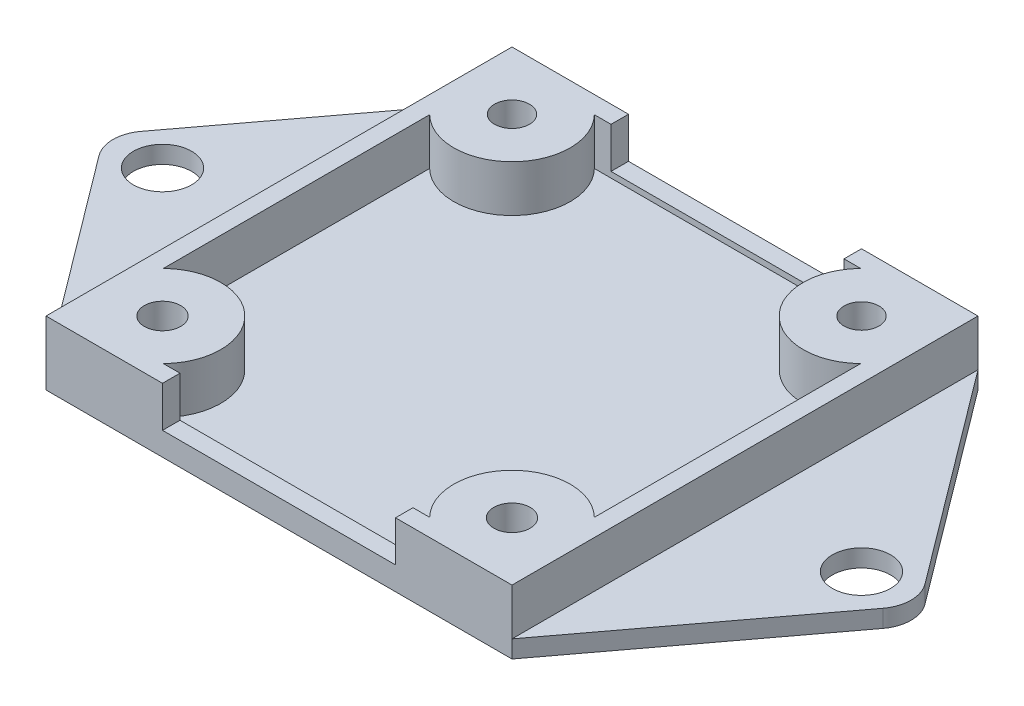
ISO-10303-21;
HEADER;
FILE_DESCRIPTION(('STEP AP214'),'2;1');
FILE_NAME('part.step','',(''),(''),'','','');
FILE_SCHEMA(('AUTOMOTIVE_DESIGN { 1 0 10303 214 1 1 1 1 }'));
ENDSEC;
DATA;
#1=APPLICATION_CONTEXT('core data for automotive mechanical design processes');
#2=APPLICATION_PROTOCOL_DEFINITION('international standard','automotive_design',2000,#1);
#3=PRODUCT_CONTEXT('',#1,'mechanical');
#4=PRODUCT('Part','Part','',(#3));
#5=PRODUCT_RELATED_PRODUCT_CATEGORY('part','',(#4));
#6=PRODUCT_DEFINITION_FORMATION('','',#4);
#7=PRODUCT_DEFINITION_CONTEXT('part definition',#1,'design');
#8=PRODUCT_DEFINITION('design','',#6,#7);
#9=PRODUCT_DEFINITION_SHAPE('','',#8);
#10=(LENGTH_UNIT() NAMED_UNIT(*) SI_UNIT(.MILLI.,.METRE.));
#11=(NAMED_UNIT(*) PLANE_ANGLE_UNIT() SI_UNIT($,.RADIAN.));
#12=(NAMED_UNIT(*) SI_UNIT($,.STERADIAN.) SOLID_ANGLE_UNIT());
#13=UNCERTAINTY_MEASURE_WITH_UNIT(LENGTH_MEASURE(1.E-05),#10,'distance_accuracy_value','');
#14=(GEOMETRIC_REPRESENTATION_CONTEXT(3) GLOBAL_UNCERTAINTY_ASSIGNED_CONTEXT((#13)) GLOBAL_UNIT_ASSIGNED_CONTEXT((#10,
#11,#12)) REPRESENTATION_CONTEXT('',''));
#15=CARTESIAN_POINT('',(0.,0.,0.));
#16=DIRECTION('',(0.,0.,1.));
#17=DIRECTION('',(1.,0.,0.));
#18=AXIS2_PLACEMENT_3D('',#15,#16,#17);
#19=CARTESIAN_POINT('',(0.,5.5,0.));
#20=DIRECTION('',(0.,1.,0.));
#21=DIRECTION('',(0.,0.,1.));
#22=AXIS2_PLACEMENT_3D('',#19,#20,#21);
#23=PLANE('',#22);
#24=DIRECTION('',(0.,0.,-1.));
#25=VECTOR('',#24,1.);
#26=CARTESIAN_POINT('',(9.99999999999999,5.5,-18.));
#27=LINE('',#26,#25);
#28=CARTESIAN_POINT('',(9.99999999999999,5.5,-18.5));
#29=VERTEX_POINT('',#28);
#30=CARTESIAN_POINT('',(9.99999999999999,5.5,-20.));
#31=VERTEX_POINT('',#30);
#32=EDGE_CURVE('E222',#29,#31,#27,.T.);
#33=ORIENTED_EDGE('',*,*,#32,.F.);
#34=DIRECTION('',(-1.,0.,0.));
#35=VECTOR('',#34,1.);
#36=CARTESIAN_POINT('',(-11.4292857857286,5.5,-18.5));
#37=LINE('',#36,#35);
#38=CARTESIAN_POINT('',(11.4292857857286,5.5,-18.5));
#39=VERTEX_POINT('',#38);
#40=EDGE_CURVE('E276',#39,#29,#37,.T.);
#41=ORIENTED_EDGE('',*,*,#40,.F.);
#42=CARTESIAN_POINT('',(15.,5.5,-15.));
#43=DIRECTION('',(0.,-1.,0.));
#44=DIRECTION('',(0.,0.,-1.));
#45=AXIS2_PLACEMENT_3D('',#42,#43,#44);
#46=CIRCLE('',#45,5.00000000000001);
#47=CARTESIAN_POINT('',(18.5,5.5,-11.4292857857286));
#48=VERTEX_POINT('',#47);
#49=EDGE_CURVE('E272',#48,#39,#46,.T.);
#50=ORIENTED_EDGE('',*,*,#49,.F.);
#51=DIRECTION('',(0.,0.,-1.));
#52=VECTOR('',#51,1.);
#53=CARTESIAN_POINT('',(18.5,5.5,-11.4292857857286));
#54=LINE('',#53,#52);
#55=CARTESIAN_POINT('',(18.5,5.5,11.4292857857286));
#56=VERTEX_POINT('',#55);
#57=EDGE_CURVE('E292',#56,#48,#54,.T.);
#58=ORIENTED_EDGE('',*,*,#57,.F.);
#59=CARTESIAN_POINT('',(15.,5.5,15.));
#60=DIRECTION('',(0.,-1.,0.));
#61=DIRECTION('',(0.,0.,1.));
#62=AXIS2_PLACEMENT_3D('',#59,#60,#61);
#63=CIRCLE('',#62,5.00000000000001);
#64=CARTESIAN_POINT('',(11.4292857857286,5.5,18.5));
#65=VERTEX_POINT('',#64);
#66=EDGE_CURVE('E289',#65,#56,#63,.T.);
#67=ORIENTED_EDGE('',*,*,#66,.F.);
#68=DIRECTION('',(1.,0.,0.));
#69=VECTOR('',#68,1.);
#70=CARTESIAN_POINT('',(-11.4292857857286,5.5,18.5));
#71=LINE('',#70,#69);
#72=CARTESIAN_POINT('',(10.,5.5,18.5));
#73=VERTEX_POINT('',#72);
#74=EDGE_CURVE('E285',#73,#65,#71,.T.);
#75=ORIENTED_EDGE('',*,*,#74,.F.);
#76=DIRECTION('',(0.,0.,1.));
#77=VECTOR('',#76,1.);
#78=CARTESIAN_POINT('',(10.,5.5,18.));
#79=LINE('',#78,#77);
#80=CARTESIAN_POINT('',(10.,5.5,20.));
#81=VERTEX_POINT('',#80);
#82=EDGE_CURVE('E244',#73,#81,#79,.T.);
#83=ORIENTED_EDGE('',*,*,#82,.T.);
#84=DIRECTION('',(1.,0.,0.));
#85=VECTOR('',#84,1.);
#86=CARTESIAN_POINT('',(-20.,5.5,20.));
#87=LINE('',#86,#85);
#88=CARTESIAN_POINT('',(20.,5.5,20.));
#89=VERTEX_POINT('',#88);
#90=EDGE_CURVE('E343',#81,#89,#87,.T.);
#91=ORIENTED_EDGE('',*,*,#90,.T.);
#92=DIRECTION('',(0.,0.,-1.));
#93=VECTOR('',#92,1.);
#94=CARTESIAN_POINT('',(20.,5.5,-20.));
#95=LINE('',#94,#93);
#96=CARTESIAN_POINT('',(20.,5.5,-20.));
#97=VERTEX_POINT('',#96);
#98=EDGE_CURVE('E334',#89,#97,#95,.T.);
#99=ORIENTED_EDGE('',*,*,#98,.T.);
#100=DIRECTION('',(-1.,0.,0.));
#101=VECTOR('',#100,1.);
#102=CARTESIAN_POINT('',(-20.,5.5,-20.));
#103=LINE('',#102,#101);
#104=EDGE_CURVE('E339',#97,#31,#103,.T.);
#105=ORIENTED_EDGE('',*,*,#104,.T.);
#106=EDGE_LOOP('',(#33,#41,#50,#58,#67,#75,#83,#91,#99,#105));
#107=FACE_BOUND('',#106,.T.);
#108=CARTESIAN_POINT('',(15.,5.5,-15.));
#109=DIRECTION('',(0.,1.,0.));
#110=DIRECTION('',(0.,0.,-1.));
#111=AXIS2_PLACEMENT_3D('',#108,#109,#110);
#112=CIRCLE('',#111,1.5);
#113=CARTESIAN_POINT('',(15.,5.5,-16.5));
#114=VERTEX_POINT('',#113);
#115=EDGE_CURVE('E247',#114,#114,#112,.T.);
#116=ORIENTED_EDGE('',*,*,#115,.F.);
#117=EDGE_LOOP('',(#116));
#118=FACE_BOUND('',#117,.T.);
#119=CARTESIAN_POINT('',(15.,5.5,15.));
#120=DIRECTION('',(0.,1.,0.));
#121=DIRECTION('',(0.,0.,1.));
#122=AXIS2_PLACEMENT_3D('',#119,#120,#121);
#123=CIRCLE('',#122,1.55820488692154);
#124=CARTESIAN_POINT('',(15.,5.5,16.5582048869215));
#125=VERTEX_POINT('',#124);
#126=EDGE_CURVE('E263',#125,#125,#123,.T.);
#127=ORIENTED_EDGE('',*,*,#126,.F.);
#128=EDGE_LOOP('',(#127));
#129=FACE_BOUND('',#128,.T.);
#130=ADVANCED_FACE('F33',(#107,#118,#129),#23,.T.);
#131=CARTESIAN_POINT('',(0.,1.5,0.));
#132=DIRECTION('',(0.,1.,0.));
#133=DIRECTION('',(0.,0.,1.));
#134=AXIS2_PLACEMENT_3D('',#131,#132,#133);
#135=PLANE('',#134);
#136=DIRECTION('',(0.6,0.,-0.8));
#137=VECTOR('',#136,1.);
#138=CARTESIAN_POINT('',(35.,1.5,0.));
#139=LINE('',#138,#137);
#140=CARTESIAN_POINT('',(20.,1.5,20.));
#141=VERTEX_POINT('',#140);
#142=CARTESIAN_POINT('',(33.65,1.5,1.8));
#143=VERTEX_POINT('',#142);
#144=EDGE_CURVE('E394',#141,#143,#139,.T.);
#145=ORIENTED_EDGE('',*,*,#144,.T.);
#146=CARTESIAN_POINT('',(31.25,1.5,0.));
#147=DIRECTION('',(0.,1.,0.));
#148=DIRECTION('',(0.,0.,1.));
#149=AXIS2_PLACEMENT_3D('',#146,#147,#148);
#150=CIRCLE('',#149,3.);
#151=CARTESIAN_POINT('',(33.65,1.5,-1.80000000000001));
#152=VERTEX_POINT('',#151);
#153=EDGE_CURVE('E449',#143,#152,#150,.T.);
#154=ORIENTED_EDGE('',*,*,#153,.T.);
#155=DIRECTION('',(-0.6,0.,-0.8));
#156=VECTOR('',#155,1.);
#157=CARTESIAN_POINT('',(20.,1.5,-20.));
#158=LINE('',#157,#156);
#159=CARTESIAN_POINT('',(20.,1.5,-20.));
#160=VERTEX_POINT('',#159);
#161=EDGE_CURVE('E397',#152,#160,#158,.T.);
#162=ORIENTED_EDGE('',*,*,#161,.T.);
#163=DIRECTION('',(0.,0.,-1.));
#164=VECTOR('',#163,1.);
#165=CARTESIAN_POINT('',(20.,1.5,-20.));
#166=LINE('',#165,#164);
#167=EDGE_CURVE('E333',#141,#160,#166,.T.);
#168=ORIENTED_EDGE('',*,*,#167,.F.);
#169=EDGE_LOOP('',(#145,#154,#162,#168));
#170=FACE_BOUND('',#169,.T.);
#171=CARTESIAN_POINT('',(30.,1.5,0.));
#172=DIRECTION('',(0.,1.,0.));
#173=DIRECTION('',(0.,0.,-1.));
#174=AXIS2_PLACEMENT_3D('',#171,#172,#173);
#175=CIRCLE('',#174,2.5);
#176=CARTESIAN_POINT('',(30.,1.5,-2.50000000000002));
#177=VERTEX_POINT('',#176);
#178=EDGE_CURVE('E364',#177,#177,#175,.T.);
#179=ORIENTED_EDGE('',*,*,#178,.F.);
#180=EDGE_LOOP('',(#179));
#181=FACE_BOUND('',#180,.T.);
#182=ADVANCED_FACE('F527',(#170,#181),#135,.T.);
#183=CARTESIAN_POINT('',(15.,1.5,15.));
#184=DIRECTION('',(0.,1.,0.));
#185=DIRECTION('',(0.,0.,-1.));
#186=AXIS2_PLACEMENT_3D('',#183,#184,#185);
#187=CIRCLE('',#186,1.5);
#188=CARTESIAN_POINT('',(15.,1.5,13.5));
#189=VERTEX_POINT('',#188);
#190=EDGE_CURVE('E382',#189,#189,#187,.T.);
#191=ORIENTED_EDGE('',*,*,#190,.F.);
#192=EDGE_LOOP('',(#191));
#193=FACE_BOUND('',#192,.T.);
#194=CARTESIAN_POINT('',(15.,1.5,15.));
#195=DIRECTION('',(0.,1.,0.));
#196=DIRECTION('',(0.,0.,1.));
#197=AXIS2_PLACEMENT_3D('',#194,#195,#196);
#198=CIRCLE('',#197,1.55820488692154);
#199=CARTESIAN_POINT('',(15.,1.5,16.5582048869215));
#200=VERTEX_POINT('',#199);
#201=EDGE_CURVE('E260',#200,#200,#198,.T.);
#202=ORIENTED_EDGE('',*,*,#201,.T.);
#203=EDGE_LOOP('',(#202));
#204=FACE_BOUND('',#203,.T.);
#205=ADVANCED_FACE('F533',(#193,#204),#135,.T.);
#206=CARTESIAN_POINT('',(-15.,1.5,15.));
#207=DIRECTION('',(0.,1.,0.));
#208=DIRECTION('',(0.,0.,-1.));
#209=AXIS2_PLACEMENT_3D('',#206,#207,#208);
#210=CIRCLE('',#209,1.49999999999999);
#211=CARTESIAN_POINT('',(-15.,1.5,13.5));
#212=VERTEX_POINT('',#211);
#213=EDGE_CURVE('E376',#212,#212,#210,.T.);
#214=ORIENTED_EDGE('',*,*,#213,.F.);
#215=EDGE_LOOP('',(#214));
#216=FACE_BOUND('',#215,.T.);
#217=CARTESIAN_POINT('',(-15.,1.5,15.));
#218=DIRECTION('',(0.,1.,0.));
#219=DIRECTION('',(0.,0.,-1.));
#220=AXIS2_PLACEMENT_3D('',#217,#218,#219);
#221=CIRCLE('',#220,1.55820488692154);
#222=CARTESIAN_POINT('',(-15.,1.5,13.4417951130785));
#223=VERTEX_POINT('',#222);
#224=EDGE_CURVE('E256',#223,#223,#221,.T.);
#225=ORIENTED_EDGE('',*,*,#224,.T.);
#226=EDGE_LOOP('',(#225));
#227=FACE_BOUND('',#226,.T.);
#228=ADVANCED_FACE('F573',(#216,#227),#135,.T.);
#229=DIRECTION('',(-0.6,0.,0.8));
#230=VECTOR('',#229,1.);
#231=CARTESIAN_POINT('',(-20.,1.5,-20.));
#232=LINE('',#231,#230);
#233=CARTESIAN_POINT('',(-20.,1.5,-20.));
#234=VERTEX_POINT('',#233);
#235=CARTESIAN_POINT('',(-33.65,1.5,-1.8));
#236=VERTEX_POINT('',#235);
#237=EDGE_CURVE('E400',#234,#236,#232,.T.);
#238=ORIENTED_EDGE('',*,*,#237,.T.);
#239=CARTESIAN_POINT('',(-31.25,1.5,0.));
#240=DIRECTION('',(0.,1.,0.));
#241=DIRECTION('',(0.,0.,1.));
#242=AXIS2_PLACEMENT_3D('',#239,#240,#241);
#243=CIRCLE('',#242,3.);
#244=CARTESIAN_POINT('',(-33.65,1.5,1.8));
#245=VERTEX_POINT('',#244);
#246=EDGE_CURVE('E11',#236,#245,#243,.T.);
#247=ORIENTED_EDGE('',*,*,#246,.T.);
#248=DIRECTION('',(0.6,0.,0.8));
#249=VECTOR('',#248,1.);
#250=CARTESIAN_POINT('',(-35.,1.5,0.));
#251=LINE('',#250,#249);
#252=CARTESIAN_POINT('',(-20.,1.5,20.));
#253=VERTEX_POINT('',#252);
#254=EDGE_CURVE('E402',#245,#253,#251,.T.);
#255=ORIENTED_EDGE('',*,*,#254,.T.);
#256=DIRECTION('',(0.,0.,1.));
#257=VECTOR('',#256,1.);
#258=CARTESIAN_POINT('',(-20.,1.5,-20.));
#259=LINE('',#258,#257);
#260=EDGE_CURVE('E338',#234,#253,#259,.T.);
#261=ORIENTED_EDGE('',*,*,#260,.F.);
#262=EDGE_LOOP('',(#238,#247,#255,#261));
#263=FACE_BOUND('',#262,.T.);
#264=CARTESIAN_POINT('',(-30.,1.5,0.));
#265=DIRECTION('',(0.,1.,0.));
#266=DIRECTION('',(0.,0.,1.));
#267=AXIS2_PLACEMENT_3D('',#264,#265,#266);
#268=CIRCLE('',#267,2.5);
#269=CARTESIAN_POINT('',(-30.,1.5,2.5));
#270=VERTEX_POINT('',#269);
#271=EDGE_CURVE('E370',#270,#270,#268,.T.);
#272=ORIENTED_EDGE('',*,*,#271,.F.);
#273=EDGE_LOOP('',(#272));
#274=FACE_BOUND('',#273,.T.);
#275=ADVANCED_FACE('F512',(#263,#274),#135,.T.);
#276=CARTESIAN_POINT('',(0.,0.,0.));
#277=DIRECTION('',(0.,1.,0.));
#278=DIRECTION('',(0.,0.,1.));
#279=AXIS2_PLACEMENT_3D('',#276,#277,#278);
#280=PLANE('',#279);
#281=DIRECTION('',(-0.6,0.,-0.8));
#282=VECTOR('',#281,1.);
#283=CARTESIAN_POINT('',(20.,0.,-20.));
#284=LINE('',#283,#282);
#285=CARTESIAN_POINT('',(33.65,0.,-1.80000000000001));
#286=VERTEX_POINT('',#285);
#287=CARTESIAN_POINT('',(20.,0.,-20.));
#288=VERTEX_POINT('',#287);
#289=EDGE_CURVE('E407',#286,#288,#284,.T.);
#290=ORIENTED_EDGE('',*,*,#289,.F.);
#291=CARTESIAN_POINT('',(31.25,0.,0.));
#292=DIRECTION('',(0.,1.,0.));
#293=DIRECTION('',(0.,0.,1.));
#294=AXIS2_PLACEMENT_3D('',#291,#292,#293);
#295=CIRCLE('',#294,3.);
#296=CARTESIAN_POINT('',(33.65,0.,1.8));
#297=VERTEX_POINT('',#296);
#298=EDGE_CURVE('E445',#286,#297,#295,.F.);
#299=ORIENTED_EDGE('',*,*,#298,.T.);
#300=DIRECTION('',(0.6,0.,-0.8));
#301=VECTOR('',#300,1.);
#302=CARTESIAN_POINT('',(35.,0.,0.));
#303=LINE('',#302,#301);
#304=CARTESIAN_POINT('',(20.,0.,20.));
#305=VERTEX_POINT('',#304);
#306=EDGE_CURVE('E393',#305,#297,#303,.T.);
#307=ORIENTED_EDGE('',*,*,#306,.F.);
#308=DIRECTION('',(1.,0.,0.));
#309=VECTOR('',#308,1.);
#310=CARTESIAN_POINT('',(-20.,0.,20.));
#311=LINE('',#310,#309);
#312=CARTESIAN_POINT('',(-20.,0.,20.));
#313=VERTEX_POINT('',#312);
#314=EDGE_CURVE('E398',#313,#305,#311,.T.);
#315=ORIENTED_EDGE('',*,*,#314,.F.);
#316=DIRECTION('',(0.6,0.,0.8));
#317=VECTOR('',#316,1.);
#318=CARTESIAN_POINT('',(-35.,0.,0.));
#319=LINE('',#318,#317);
#320=CARTESIAN_POINT('',(-33.65,0.,1.8));
#321=VERTEX_POINT('',#320);
#322=EDGE_CURVE('E413',#321,#313,#319,.T.);
#323=ORIENTED_EDGE('',*,*,#322,.F.);
#324=CARTESIAN_POINT('',(-31.25,0.,0.));
#325=DIRECTION('',(0.,1.,0.));
#326=DIRECTION('',(0.,0.,1.));
#327=AXIS2_PLACEMENT_3D('',#324,#325,#326);
#328=CIRCLE('',#327,3.);
#329=CARTESIAN_POINT('',(-33.65,0.,-1.8));
#330=VERTEX_POINT('',#329);
#331=EDGE_CURVE('E443',#321,#330,#328,.F.);
#332=ORIENTED_EDGE('',*,*,#331,.T.);
#333=DIRECTION('',(-0.6,0.,0.8));
#334=VECTOR('',#333,1.);
#335=CARTESIAN_POINT('',(-20.,0.,-20.));
#336=LINE('',#335,#334);
#337=CARTESIAN_POINT('',(-20.,0.,-20.));
#338=VERTEX_POINT('',#337);
#339=EDGE_CURVE('E411',#338,#330,#336,.T.);
#340=ORIENTED_EDGE('',*,*,#339,.F.);
#341=DIRECTION('',(-1.,0.,0.));
#342=VECTOR('',#341,1.);
#343=CARTESIAN_POINT('',(-20.,0.,-20.));
#344=LINE('',#343,#342);
#345=EDGE_CURVE('E409',#288,#338,#344,.T.);
#346=ORIENTED_EDGE('',*,*,#345,.F.);
#347=EDGE_LOOP('',(#290,#299,#307,#315,#323,#332,#340,#346));
#348=FACE_BOUND('',#347,.T.);
#349=CARTESIAN_POINT('',(-15.,0.,-15.));
#350=DIRECTION('',(0.,1.,0.));
#351=DIRECTION('',(0.,0.,1.));
#352=AXIS2_PLACEMENT_3D('',#349,#350,#351);
#353=CIRCLE('',#352,1.5);
#354=CARTESIAN_POINT('',(-15.,0.,-13.5));
#355=VERTEX_POINT('',#354);
#356=EDGE_CURVE('E390',#355,#355,#353,.T.);
#357=ORIENTED_EDGE('',*,*,#356,.T.);
#358=EDGE_LOOP('',(#357));
#359=FACE_BOUND('',#358,.T.);
#360=CARTESIAN_POINT('',(15.,0.,-15.));
#361=DIRECTION('',(0.,1.,0.));
#362=DIRECTION('',(0.,0.,1.));
#363=AXIS2_PLACEMENT_3D('',#360,#361,#362);
#364=CIRCLE('',#363,1.5);
#365=CARTESIAN_POINT('',(15.,0.,-13.5));
#366=VERTEX_POINT('',#365);
#367=EDGE_CURVE('E385',#366,#366,#364,.T.);
#368=ORIENTED_EDGE('',*,*,#367,.T.);
#369=EDGE_LOOP('',(#368));
#370=FACE_BOUND('',#369,.T.);
#371=CARTESIAN_POINT('',(15.,0.,15.));
#372=DIRECTION('',(0.,1.,0.));
#373=DIRECTION('',(0.,0.,-1.));
#374=AXIS2_PLACEMENT_3D('',#371,#372,#373);
#375=CIRCLE('',#374,1.5);
#376=CARTESIAN_POINT('',(15.,0.,13.5));
#377=VERTEX_POINT('',#376);
#378=EDGE_CURVE('E379',#377,#377,#375,.T.);
#379=ORIENTED_EDGE('',*,*,#378,.T.);
#380=EDGE_LOOP('',(#379));
#381=FACE_BOUND('',#380,.T.);
#382=CARTESIAN_POINT('',(-15.,0.,15.));
#383=DIRECTION('',(0.,1.,0.));
#384=DIRECTION('',(0.,0.,-1.));
#385=AXIS2_PLACEMENT_3D('',#382,#383,#384);
#386=CIRCLE('',#385,1.49999999999999);
#387=CARTESIAN_POINT('',(-15.,0.,13.5));
#388=VERTEX_POINT('',#387);
#389=EDGE_CURVE('E373',#388,#388,#386,.T.);
#390=ORIENTED_EDGE('',*,*,#389,.T.);
#391=EDGE_LOOP('',(#390));
#392=FACE_BOUND('',#391,.T.);
#393=CARTESIAN_POINT('',(-30.,0.,0.));
#394=DIRECTION('',(0.,1.,0.));
#395=DIRECTION('',(0.,0.,1.));
#396=AXIS2_PLACEMENT_3D('',#393,#394,#395);
#397=CIRCLE('',#396,2.5);
#398=CARTESIAN_POINT('',(-30.,0.,2.5));
#399=VERTEX_POINT('',#398);
#400=EDGE_CURVE('E367',#399,#399,#397,.T.);
#401=ORIENTED_EDGE('',*,*,#400,.T.);
#402=EDGE_LOOP('',(#401));
#403=FACE_BOUND('',#402,.T.);
#404=CARTESIAN_POINT('',(30.,0.,0.));
#405=DIRECTION('',(0.,1.,0.));
#406=DIRECTION('',(0.,0.,-1.));
#407=AXIS2_PLACEMENT_3D('',#404,#405,#406);
#408=CIRCLE('',#407,2.5);
#409=CARTESIAN_POINT('',(30.,0.,-2.50000000000002));
#410=VERTEX_POINT('',#409);
#411=EDGE_CURVE('E363',#410,#410,#408,.T.);
#412=ORIENTED_EDGE('',*,*,#411,.T.);
#413=EDGE_LOOP('',(#412));
#414=FACE_BOUND('',#413,.T.);
#415=ADVANCED_FACE('F462',(#348,#359,#370,#381,#392,#403,#414),#280,.F.);
#416=CARTESIAN_POINT('',(35.,1.5,0.));
#417=DIRECTION('',(-0.8,0.,-0.6));
#418=DIRECTION('',(-0.6,0.,0.8));
#419=AXIS2_PLACEMENT_3D('',#416,#417,#418);
#420=PLANE('',#419);
#421=ORIENTED_EDGE('',*,*,#306,.T.);
#422=DIRECTION('',(0.,-1.,0.));
#423=VECTOR('',#422,1.);
#424=CARTESIAN_POINT('',(33.65,1.5,1.8));
#425=LINE('',#424,#423);
#426=EDGE_CURVE('E447',#297,#143,#425,.F.);
#427=ORIENTED_EDGE('',*,*,#426,.T.);
#428=ORIENTED_EDGE('',*,*,#144,.F.);
#429=DIRECTION('',(0.,-1.,0.));
#430=VECTOR('',#429,1.);
#431=CARTESIAN_POINT('',(20.,1.5,20.));
#432=LINE('',#431,#430);
#433=EDGE_CURVE('E404',#141,#305,#432,.T.);
#434=ORIENTED_EDGE('',*,*,#433,.T.);
#435=EDGE_LOOP('',(#421,#427,#428,#434));
#436=FACE_BOUND('',#435,.T.);
#437=ADVANCED_FACE('F473',(#436),#420,.F.);
#438=CARTESIAN_POINT('',(20.,1.5,-20.));
#439=DIRECTION('',(-0.8,0.,0.6));
#440=DIRECTION('',(0.6,0.,0.8));
#441=AXIS2_PLACEMENT_3D('',#438,#439,#440);
#442=PLANE('',#441);
#443=ORIENTED_EDGE('',*,*,#161,.F.);
#444=DIRECTION('',(0.,-1.,0.));
#445=VECTOR('',#444,1.);
#446=CARTESIAN_POINT('',(33.65,1.5,-1.80000000000001));
#447=LINE('',#446,#445);
#448=EDGE_CURVE('E440',#152,#286,#447,.T.);
#449=ORIENTED_EDGE('',*,*,#448,.T.);
#450=ORIENTED_EDGE('',*,*,#289,.T.);
#451=DIRECTION('',(0.,-1.,0.));
#452=VECTOR('',#451,1.);
#453=CARTESIAN_POINT('',(20.,1.5,-20.));
#454=LINE('',#453,#452);
#455=EDGE_CURVE('E424',#160,#288,#454,.T.);
#456=ORIENTED_EDGE('',*,*,#455,.F.);
#457=EDGE_LOOP('',(#443,#449,#450,#456));
#458=FACE_BOUND('',#457,.T.);
#459=ADVANCED_FACE('F524',(#458),#442,.F.);
#460=CARTESIAN_POINT('',(-20.,1.5,-20.));
#461=DIRECTION('',(0.,0.,1.));
#462=DIRECTION('',(1.,0.,0.));
#463=AXIS2_PLACEMENT_3D('',#460,#461,#462);
#464=PLANE('',#463);
#465=DIRECTION('',(-1.,0.,0.));
#466=VECTOR('',#465,1.);
#467=CARTESIAN_POINT('',(9.99999999999999,2.,-20.));
#468=LINE('',#467,#466);
#469=CARTESIAN_POINT('',(9.99999999999999,2.,-20.));
#470=VERTEX_POINT('',#469);
#471=CARTESIAN_POINT('',(-10.,2.,-20.));
#472=VERTEX_POINT('',#471);
#473=EDGE_CURVE('E209',#470,#472,#468,.T.);
#474=ORIENTED_EDGE('',*,*,#473,.F.);
#475=DIRECTION('',(0.,-1.,0.));
#476=VECTOR('',#475,1.);
#477=CARTESIAN_POINT('',(9.99999999999999,5.5,-20.));
#478=LINE('',#477,#476);
#479=EDGE_CURVE('E219',#31,#470,#478,.T.);
#480=ORIENTED_EDGE('',*,*,#479,.F.);
#481=ORIENTED_EDGE('',*,*,#104,.F.);
#482=DIRECTION('',(0.,-1.,0.));
#483=VECTOR('',#482,1.);
#484=CARTESIAN_POINT('',(20.,5.5,-20.));
#485=LINE('',#484,#483);
#486=EDGE_CURVE('E360',#97,#160,#485,.T.);
#487=ORIENTED_EDGE('',*,*,#486,.T.);
#488=ORIENTED_EDGE('',*,*,#455,.T.);
#489=ORIENTED_EDGE('',*,*,#345,.T.);
#490=DIRECTION('',(0.,-1.,0.));
#491=VECTOR('',#490,1.);
#492=CARTESIAN_POINT('',(-20.,1.5,-20.));
#493=LINE('',#492,#491);
#494=EDGE_CURVE('E421',#234,#338,#493,.T.);
#495=ORIENTED_EDGE('',*,*,#494,.F.);
#496=DIRECTION('',(0.,-1.,0.));
#497=VECTOR('',#496,1.);
#498=CARTESIAN_POINT('',(-20.,5.5,-20.));
#499=LINE('',#498,#497);
#500=CARTESIAN_POINT('',(-20.,5.5,-20.));
#501=VERTEX_POINT('',#500);
#502=EDGE_CURVE('E357',#501,#234,#499,.T.);
#503=ORIENTED_EDGE('',*,*,#502,.F.);
#504=CARTESIAN_POINT('',(-10.,5.5,-20.));
#505=VERTEX_POINT('',#504);
#506=EDGE_CURVE('E337',#505,#501,#103,.T.);
#507=ORIENTED_EDGE('',*,*,#506,.F.);
#508=DIRECTION('',(0.,1.,0.));
#509=VECTOR('',#508,1.);
#510=CARTESIAN_POINT('',(-10.,5.5,-20.));
#511=LINE('',#510,#509);
#512=EDGE_CURVE('E216',#472,#505,#511,.T.);
#513=ORIENTED_EDGE('',*,*,#512,.F.);
#514=EDGE_LOOP('',(#474,#480,#481,#487,#488,#489,#495,#503,#507,#513));
#515=FACE_BOUND('',#514,.T.);
#516=ADVANCED_FACE('F226',(#515),#464,.F.);
#517=CARTESIAN_POINT('',(-20.,1.5,-20.));
#518=DIRECTION('',(0.8,0.,0.6));
#519=DIRECTION('',(0.6,0.,-0.8));
#520=AXIS2_PLACEMENT_3D('',#517,#518,#519);
#521=PLANE('',#520);
#522=ORIENTED_EDGE('',*,*,#339,.T.);
#523=DIRECTION('',(0.,-1.,0.));
#524=VECTOR('',#523,1.);
#525=CARTESIAN_POINT('',(-33.65,1.5,-1.8));
#526=LINE('',#525,#524);
#527=EDGE_CURVE('E41',#330,#236,#526,.F.);
#528=ORIENTED_EDGE('',*,*,#527,.T.);
#529=ORIENTED_EDGE('',*,*,#237,.F.);
#530=ORIENTED_EDGE('',*,*,#494,.T.);
#531=EDGE_LOOP('',(#522,#528,#529,#530));
#532=FACE_BOUND('',#531,.T.);
#533=ADVANCED_FACE('F515',(#532),#521,.F.);
#534=CARTESIAN_POINT('',(-35.,1.5,0.));
#535=DIRECTION('',(0.8,0.,-0.6));
#536=DIRECTION('',(-0.6,0.,-0.8));
#537=AXIS2_PLACEMENT_3D('',#534,#535,#536);
#538=PLANE('',#537);
#539=ORIENTED_EDGE('',*,*,#254,.F.);
#540=DIRECTION('',(0.,-1.,0.));
#541=VECTOR('',#540,1.);
#542=CARTESIAN_POINT('',(-33.65,1.5,1.8));
#543=LINE('',#542,#541);
#544=EDGE_CURVE('E451',#245,#321,#543,.T.);
#545=ORIENTED_EDGE('',*,*,#544,.T.);
#546=ORIENTED_EDGE('',*,*,#322,.T.);
#547=DIRECTION('',(0.,-1.,0.));
#548=VECTOR('',#547,1.);
#549=CARTESIAN_POINT('',(-20.,1.5,20.));
#550=LINE('',#549,#548);
#551=EDGE_CURVE('E418',#253,#313,#550,.T.);
#552=ORIENTED_EDGE('',*,*,#551,.F.);
#553=EDGE_LOOP('',(#539,#545,#546,#552));
#554=FACE_BOUND('',#553,.T.);
#555=ADVANCED_FACE('F456',(#554),#538,.F.);
#556=CARTESIAN_POINT('',(-20.,1.5,20.));
#557=DIRECTION('',(0.,0.,-1.));
#558=DIRECTION('',(-1.,0.,0.));
#559=AXIS2_PLACEMENT_3D('',#556,#557,#558);
#560=PLANE('',#559);
#561=ORIENTED_EDGE('',*,*,#90,.F.);
#562=DIRECTION('',(0.,1.,0.));
#563=VECTOR('',#562,1.);
#564=CARTESIAN_POINT('',(10.,2.,20.));
#565=LINE('',#564,#563);
#566=CARTESIAN_POINT('',(10.,2.,20.));
#567=VERTEX_POINT('',#566);
#568=EDGE_CURVE('E232',#567,#81,#565,.T.);
#569=ORIENTED_EDGE('',*,*,#568,.F.);
#570=DIRECTION('',(1.,0.,0.));
#571=VECTOR('',#570,1.);
#572=CARTESIAN_POINT('',(-10.,2.,20.));
#573=LINE('',#572,#571);
#574=CARTESIAN_POINT('',(-10.,2.,20.));
#575=VERTEX_POINT('',#574);
#576=EDGE_CURVE('E241',#575,#567,#573,.T.);
#577=ORIENTED_EDGE('',*,*,#576,.F.);
#578=DIRECTION('',(0.,-1.,0.));
#579=VECTOR('',#578,1.);
#580=CARTESIAN_POINT('',(-10.,2.,20.));
#581=LINE('',#580,#579);
#582=CARTESIAN_POINT('',(-10.,5.5,20.));
#583=VERTEX_POINT('',#582);
#584=EDGE_CURVE('E238',#583,#575,#581,.T.);
#585=ORIENTED_EDGE('',*,*,#584,.F.);
#586=CARTESIAN_POINT('',(-20.,5.5,20.));
#587=VERTEX_POINT('',#586);
#588=EDGE_CURVE('E344',#587,#583,#87,.T.);
#589=ORIENTED_EDGE('',*,*,#588,.F.);
#590=DIRECTION('',(0.,-1.,0.));
#591=VECTOR('',#590,1.);
#592=CARTESIAN_POINT('',(-20.,5.5,20.));
#593=LINE('',#592,#591);
#594=EDGE_CURVE('E354',#587,#253,#593,.T.);
#595=ORIENTED_EDGE('',*,*,#594,.T.);
#596=ORIENTED_EDGE('',*,*,#551,.T.);
#597=ORIENTED_EDGE('',*,*,#314,.T.);
#598=ORIENTED_EDGE('',*,*,#433,.F.);
#599=DIRECTION('',(0.,-1.,0.));
#600=VECTOR('',#599,1.);
#601=CARTESIAN_POINT('',(20.,5.5,20.));
#602=LINE('',#601,#600);
#603=EDGE_CURVE('E347',#89,#141,#602,.T.);
#604=ORIENTED_EDGE('',*,*,#603,.F.);
#605=EDGE_LOOP('',(#561,#569,#577,#585,#589,#595,#596,#597,#598,#604));
#606=FACE_BOUND('',#605,.T.);
#607=ADVANCED_FACE('F469',(#606),#560,.F.);
#608=CARTESIAN_POINT('',(-15.,1.5,-15.));
#609=DIRECTION('',(0.,-1.,0.));
#610=DIRECTION('',(0.,0.,-1.));
#611=AXIS2_PLACEMENT_3D('',#608,#609,#610);
#612=CYLINDRICAL_SURFACE('',#611,1.5);
#613=ORIENTED_EDGE('',*,*,#356,.F.);
#614=EDGE_LOOP('',(#613));
#615=FACE_BOUND('',#614,.T.);
#616=CARTESIAN_POINT('',(-15.,5.5,-15.));
#617=DIRECTION('',(0.,1.,0.));
#618=DIRECTION('',(0.,0.,1.));
#619=AXIS2_PLACEMENT_3D('',#616,#617,#618);
#620=CIRCLE('',#619,1.5);
#621=CARTESIAN_POINT('',(-15.,5.5,-13.5));
#622=VERTEX_POINT('',#621);
#623=EDGE_CURVE('E266',#622,#622,#620,.T.);
#624=ORIENTED_EDGE('',*,*,#623,.T.);
#625=EDGE_LOOP('',(#624));
#626=FACE_BOUND('',#625,.T.);
#627=ADVANCED_FACE('F567',(#615,#626),#612,.F.);
#628=CARTESIAN_POINT('',(15.,1.5,-15.));
#629=DIRECTION('',(0.,-1.,0.));
#630=DIRECTION('',(0.,0.,-1.));
#631=AXIS2_PLACEMENT_3D('',#628,#629,#630);
#632=CYLINDRICAL_SURFACE('',#631,1.5);
#633=ORIENTED_EDGE('',*,*,#367,.F.);
#634=EDGE_LOOP('',(#633));
#635=FACE_BOUND('',#634,.T.);
#636=ORIENTED_EDGE('',*,*,#115,.T.);
#637=EDGE_LOOP('',(#636));
#638=FACE_BOUND('',#637,.T.);
#639=ADVANCED_FACE('F564',(#635,#638),#632,.F.);
#640=CARTESIAN_POINT('',(15.,1.5,15.));
#641=DIRECTION('',(0.,-1.,0.));
#642=DIRECTION('',(0.,0.,-1.));
#643=AXIS2_PLACEMENT_3D('',#640,#641,#642);
#644=CYLINDRICAL_SURFACE('',#643,1.5);
#645=ORIENTED_EDGE('',*,*,#190,.T.);
#646=EDGE_LOOP('',(#645));
#647=FACE_BOUND('',#646,.T.);
#648=ORIENTED_EDGE('',*,*,#378,.F.);
#649=EDGE_LOOP('',(#648));
#650=FACE_BOUND('',#649,.T.);
#651=ADVANCED_FACE('F560',(#647,#650),#644,.F.);
#652=CARTESIAN_POINT('',(-15.,1.5,15.));
#653=DIRECTION('',(0.,-1.,0.));
#654=DIRECTION('',(0.,0.,-1.));
#655=AXIS2_PLACEMENT_3D('',#652,#653,#654);
#656=CYLINDRICAL_SURFACE('',#655,1.49999999999999);
#657=ORIENTED_EDGE('',*,*,#213,.T.);
#658=EDGE_LOOP('',(#657));
#659=FACE_BOUND('',#658,.T.);
#660=ORIENTED_EDGE('',*,*,#389,.F.);
#661=EDGE_LOOP('',(#660));
#662=FACE_BOUND('',#661,.T.);
#663=ADVANCED_FACE('F553',(#659,#662),#656,.F.);
#664=CARTESIAN_POINT('',(-30.,1.5,0.));
#665=DIRECTION('',(0.,-1.,0.));
#666=DIRECTION('',(0.,0.,-1.));
#667=AXIS2_PLACEMENT_3D('',#664,#665,#666);
#668=CYLINDRICAL_SURFACE('',#667,2.5);
#669=ORIENTED_EDGE('',*,*,#271,.T.);
#670=EDGE_LOOP('',(#669));
#671=FACE_BOUND('',#670,.T.);
#672=ORIENTED_EDGE('',*,*,#400,.F.);
#673=EDGE_LOOP('',(#672));
#674=FACE_BOUND('',#673,.T.);
#675=ADVANCED_FACE('F546',(#671,#674),#668,.F.);
#676=CARTESIAN_POINT('',(30.,1.5,0.));
#677=DIRECTION('',(0.,-1.,0.));
#678=DIRECTION('',(0.,0.,-1.));
#679=AXIS2_PLACEMENT_3D('',#676,#677,#678);
#680=CYLINDRICAL_SURFACE('',#679,2.5);
#681=ORIENTED_EDGE('',*,*,#178,.T.);
#682=EDGE_LOOP('',(#681));
#683=FACE_BOUND('',#682,.T.);
#684=ORIENTED_EDGE('',*,*,#411,.F.);
#685=EDGE_LOOP('',(#684));
#686=FACE_BOUND('',#685,.T.);
#687=ADVANCED_FACE('F539',(#683,#686),#680,.F.);
#688=DIRECTION('',(0.,0.,-1.));
#689=VECTOR('',#688,1.);
#690=CARTESIAN_POINT('',(-10.,5.5,-18.));
#691=LINE('',#690,#689);
#692=CARTESIAN_POINT('',(-10.,5.5,-18.5));
#693=VERTEX_POINT('',#692);
#694=EDGE_CURVE('E233',#693,#505,#691,.T.);
#695=ORIENTED_EDGE('',*,*,#694,.T.);
#696=ORIENTED_EDGE('',*,*,#506,.T.);
#697=DIRECTION('',(0.,0.,1.));
#698=VECTOR('',#697,1.);
#699=CARTESIAN_POINT('',(-20.,5.5,-20.));
#700=LINE('',#699,#698);
#701=EDGE_CURVE('E341',#501,#587,#700,.T.);
#702=ORIENTED_EDGE('',*,*,#701,.T.);
#703=ORIENTED_EDGE('',*,*,#588,.T.);
#704=DIRECTION('',(0.,0.,1.));
#705=VECTOR('',#704,1.);
#706=CARTESIAN_POINT('',(-10.,5.5,18.));
#707=LINE('',#706,#705);
#708=CARTESIAN_POINT('',(-10.,5.5,18.5));
#709=VERTEX_POINT('',#708);
#710=EDGE_CURVE('E250',#709,#583,#707,.T.);
#711=ORIENTED_EDGE('',*,*,#710,.F.);
#712=CARTESIAN_POINT('',(-11.4292857857286,5.5,18.5));
#713=VERTEX_POINT('',#712);
#714=EDGE_CURVE('E286',#713,#709,#71,.T.);
#715=ORIENTED_EDGE('',*,*,#714,.F.);
#716=CARTESIAN_POINT('',(-15.,5.5,15.));
#717=DIRECTION('',(0.,-1.,0.));
#718=DIRECTION('',(0.,0.,-1.));
#719=AXIS2_PLACEMENT_3D('',#716,#717,#718);
#720=CIRCLE('',#719,5.00000000000001);
#721=CARTESIAN_POINT('',(-18.5,5.5,11.4292857857286));
#722=VERTEX_POINT('',#721);
#723=EDGE_CURVE('E283',#722,#713,#720,.T.);
#724=ORIENTED_EDGE('',*,*,#723,.F.);
#725=DIRECTION('',(0.,0.,1.));
#726=VECTOR('',#725,1.);
#727=CARTESIAN_POINT('',(-18.5,5.5,-11.4292857857286));
#728=LINE('',#727,#726);
#729=CARTESIAN_POINT('',(-18.5,5.5,-11.4292857857286));
#730=VERTEX_POINT('',#729);
#731=EDGE_CURVE('E281',#730,#722,#728,.T.);
#732=ORIENTED_EDGE('',*,*,#731,.F.);
#733=CARTESIAN_POINT('',(-15.,5.5,-15.));
#734=DIRECTION('',(0.,-1.,0.));
#735=DIRECTION('',(0.,0.,1.));
#736=AXIS2_PLACEMENT_3D('',#733,#734,#735);
#737=CIRCLE('',#736,5.00000000000001);
#738=CARTESIAN_POINT('',(-11.4292857857286,5.5,-18.5));
#739=VERTEX_POINT('',#738);
#740=EDGE_CURVE('E279',#739,#730,#737,.T.);
#741=ORIENTED_EDGE('',*,*,#740,.F.);
#742=EDGE_CURVE('E274',#693,#739,#37,.T.);
#743=ORIENTED_EDGE('',*,*,#742,.F.);
#744=EDGE_LOOP('',(#695,#696,#702,#703,#711,#715,#724,#732,#741,#743));
#745=FACE_BOUND('',#744,.T.);
#746=CARTESIAN_POINT('',(-15.,5.5,15.));
#747=DIRECTION('',(0.,1.,0.));
#748=DIRECTION('',(0.,0.,-1.));
#749=AXIS2_PLACEMENT_3D('',#746,#747,#748);
#750=CIRCLE('',#749,1.55820488692154);
#751=CARTESIAN_POINT('',(-15.,5.5,13.4417951130785));
#752=VERTEX_POINT('',#751);
#753=EDGE_CURVE('E257',#752,#752,#750,.T.);
#754=ORIENTED_EDGE('',*,*,#753,.F.);
#755=EDGE_LOOP('',(#754));
#756=FACE_BOUND('',#755,.T.);
#757=ORIENTED_EDGE('',*,*,#623,.F.);
#758=EDGE_LOOP('',(#757));
#759=FACE_BOUND('',#758,.T.);
#760=ADVANCED_FACE('F503',(#745,#756,#759),#23,.T.);
#761=CARTESIAN_POINT('',(20.,5.5,-20.));
#762=DIRECTION('',(-1.,0.,0.));
#763=DIRECTION('',(0.,0.,1.));
#764=AXIS2_PLACEMENT_3D('',#761,#762,#763);
#765=PLANE('',#764);
#766=ORIENTED_EDGE('',*,*,#167,.T.);
#767=ORIENTED_EDGE('',*,*,#486,.F.);
#768=ORIENTED_EDGE('',*,*,#98,.F.);
#769=ORIENTED_EDGE('',*,*,#603,.T.);
#770=EDGE_LOOP('',(#766,#767,#768,#769));
#771=FACE_BOUND('',#770,.T.);
#772=ADVANCED_FACE('F479',(#771),#765,.F.);
#773=CARTESIAN_POINT('',(-20.,5.5,-20.));
#774=DIRECTION('',(1.,0.,0.));
#775=DIRECTION('',(0.,0.,-1.));
#776=AXIS2_PLACEMENT_3D('',#773,#774,#775);
#777=PLANE('',#776);
#778=ORIENTED_EDGE('',*,*,#260,.T.);
#779=ORIENTED_EDGE('',*,*,#594,.F.);
#780=ORIENTED_EDGE('',*,*,#701,.F.);
#781=ORIENTED_EDGE('',*,*,#502,.T.);
#782=EDGE_LOOP('',(#778,#779,#780,#781));
#783=FACE_BOUND('',#782,.T.);
#784=ADVANCED_FACE('F510',(#783),#777,.F.);
#785=CARTESIAN_POINT('',(15.,5.5,-15.));
#786=DIRECTION('',(0.,-1.,0.));
#787=DIRECTION('',(0.,0.,-1.));
#788=AXIS2_PLACEMENT_3D('',#785,#786,#787);
#789=CYLINDRICAL_SURFACE('',#788,5.00000000000001);
#790=CARTESIAN_POINT('',(15.,1.5,-15.));
#791=DIRECTION('',(0.,-1.,0.));
#792=DIRECTION('',(0.,0.,-1.));
#793=AXIS2_PLACEMENT_3D('',#790,#791,#792);
#794=CIRCLE('',#793,5.00000000000001);
#795=CARTESIAN_POINT('',(18.5,1.5,-11.4292857857286));
#796=VERTEX_POINT('',#795);
#797=CARTESIAN_POINT('',(11.4292857857286,1.5,-18.5));
#798=VERTEX_POINT('',#797);
#799=EDGE_CURVE('E271',#796,#798,#794,.T.);
#800=ORIENTED_EDGE('',*,*,#799,.F.);
#801=DIRECTION('',(0.,-1.,0.));
#802=VECTOR('',#801,1.);
#803=CARTESIAN_POINT('',(18.5,5.5,-11.4292857857286));
#804=LINE('',#803,#802);
#805=EDGE_CURVE('E294',#48,#796,#804,.T.);
#806=ORIENTED_EDGE('',*,*,#805,.F.);
#807=ORIENTED_EDGE('',*,*,#49,.T.);
#808=DIRECTION('',(0.,-1.,0.));
#809=VECTOR('',#808,1.);
#810=CARTESIAN_POINT('',(11.4292857857286,5.5,-18.5));
#811=LINE('',#810,#809);
#812=EDGE_CURVE('E330',#39,#798,#811,.T.);
#813=ORIENTED_EDGE('',*,*,#812,.T.);
#814=EDGE_LOOP('',(#800,#806,#807,#813));
#815=FACE_BOUND('',#814,.T.);
#816=ADVANCED_FACE('F609',(#815),#789,.T.);
#817=CARTESIAN_POINT('',(-11.4292857857286,5.5,-18.5));
#818=DIRECTION('',(0.,0.,1.));
#819=DIRECTION('',(1.,0.,0.));
#820=AXIS2_PLACEMENT_3D('',#817,#818,#819);
#821=PLANE('',#820);
#822=DIRECTION('',(0.,1.,0.));
#823=VECTOR('',#822,1.);
#824=CARTESIAN_POINT('',(9.99999999999999,5.5,-18.5));
#825=LINE('',#824,#823);
#826=CARTESIAN_POINT('',(9.99999999999999,2.,-18.5));
#827=VERTEX_POINT('',#826);
#828=EDGE_CURVE('E438',#827,#29,#825,.T.);
#829=ORIENTED_EDGE('',*,*,#828,.F.);
#830=DIRECTION('',(1.,0.,0.));
#831=VECTOR('',#830,1.);
#832=CARTESIAN_POINT('',(-11.4292857857286,2.,-18.5));
#833=LINE('',#832,#831);
#834=CARTESIAN_POINT('',(-10.,2.,-18.5));
#835=VERTEX_POINT('',#834);
#836=EDGE_CURVE('E212',#835,#827,#833,.T.);
#837=ORIENTED_EDGE('',*,*,#836,.F.);
#838=DIRECTION('',(0.,-1.,0.));
#839=VECTOR('',#838,1.);
#840=CARTESIAN_POINT('',(-10.,5.5,-18.5));
#841=LINE('',#840,#839);
#842=EDGE_CURVE('E435',#693,#835,#841,.T.);
#843=ORIENTED_EDGE('',*,*,#842,.F.);
#844=ORIENTED_EDGE('',*,*,#742,.T.);
#845=DIRECTION('',(0.,-1.,0.));
#846=VECTOR('',#845,1.);
#847=CARTESIAN_POINT('',(-11.4292857857286,5.5,-18.5));
#848=LINE('',#847,#846);
#849=CARTESIAN_POINT('',(-11.4292857857286,1.5,-18.5));
#850=VERTEX_POINT('',#849);
#851=EDGE_CURVE('E328',#739,#850,#848,.T.);
#852=ORIENTED_EDGE('',*,*,#851,.T.);
#853=DIRECTION('',(-1.,0.,0.));
#854=VECTOR('',#853,1.);
#855=CARTESIAN_POINT('',(-11.4292857857286,1.5,-18.5));
#856=LINE('',#855,#854);
#857=EDGE_CURVE('E297',#798,#850,#856,.T.);
#858=ORIENTED_EDGE('',*,*,#857,.F.);
#859=ORIENTED_EDGE('',*,*,#812,.F.);
#860=ORIENTED_EDGE('',*,*,#40,.T.);
#861=EDGE_LOOP('',(#829,#837,#843,#844,#852,#858,#859,#860));
#862=FACE_BOUND('',#861,.T.);
#863=ADVANCED_FACE('F617',(#862),#821,.T.);
#864=CARTESIAN_POINT('',(-15.,5.5,-15.));
#865=DIRECTION('',(0.,-1.,0.));
#866=DIRECTION('',(0.,0.,-1.));
#867=AXIS2_PLACEMENT_3D('',#864,#865,#866);
#868=CYLINDRICAL_SURFACE('',#867,5.00000000000001);
#869=CARTESIAN_POINT('',(-15.,1.5,-15.));
#870=DIRECTION('',(0.,-1.,0.));
#871=DIRECTION('',(0.,0.,1.));
#872=AXIS2_PLACEMENT_3D('',#869,#870,#871);
#873=CIRCLE('',#872,5.00000000000001);
#874=CARTESIAN_POINT('',(-18.5,1.5,-11.4292857857286));
#875=VERTEX_POINT('',#874);
#876=EDGE_CURVE('E300',#850,#875,#873,.T.);
#877=ORIENTED_EDGE('',*,*,#876,.F.);
#878=ORIENTED_EDGE('',*,*,#851,.F.);
#879=ORIENTED_EDGE('',*,*,#740,.T.);
#880=DIRECTION('',(0.,-1.,0.));
#881=VECTOR('',#880,1.);
#882=CARTESIAN_POINT('',(-18.5,5.5,-11.4292857857286));
#883=LINE('',#882,#881);
#884=EDGE_CURVE('E326',#730,#875,#883,.T.);
#885=ORIENTED_EDGE('',*,*,#884,.T.);
#886=EDGE_LOOP('',(#877,#878,#879,#885));
#887=FACE_BOUND('',#886,.T.);
#888=ADVANCED_FACE('F624',(#887),#868,.T.);
#889=CARTESIAN_POINT('',(-18.5,5.5,-11.4292857857286));
#890=DIRECTION('',(1.,0.,0.));
#891=DIRECTION('',(0.,0.,-1.));
#892=AXIS2_PLACEMENT_3D('',#889,#890,#891);
#893=PLANE('',#892);
#894=DIRECTION('',(0.,0.,1.));
#895=VECTOR('',#894,1.);
#896=CARTESIAN_POINT('',(-18.5,1.5,-11.4292857857286));
#897=LINE('',#896,#895);
#898=CARTESIAN_POINT('',(-18.5,1.5,11.4292857857286));
#899=VERTEX_POINT('',#898);
#900=EDGE_CURVE('E303',#875,#899,#897,.T.);
#901=ORIENTED_EDGE('',*,*,#900,.F.);
#902=ORIENTED_EDGE('',*,*,#884,.F.);
#903=ORIENTED_EDGE('',*,*,#731,.T.);
#904=DIRECTION('',(0.,-1.,0.));
#905=VECTOR('',#904,1.);
#906=CARTESIAN_POINT('',(-18.5,5.5,11.4292857857286));
#907=LINE('',#906,#905);
#908=EDGE_CURVE('E324',#722,#899,#907,.T.);
#909=ORIENTED_EDGE('',*,*,#908,.T.);
#910=EDGE_LOOP('',(#901,#902,#903,#909));
#911=FACE_BOUND('',#910,.T.);
#912=ADVANCED_FACE('F629',(#911),#893,.T.);
#913=CARTESIAN_POINT('',(-15.,5.5,15.));
#914=DIRECTION('',(0.,-1.,0.));
#915=DIRECTION('',(0.,0.,-1.));
#916=AXIS2_PLACEMENT_3D('',#913,#914,#915);
#917=CYLINDRICAL_SURFACE('',#916,5.00000000000001);
#918=CARTESIAN_POINT('',(-15.,1.5,15.));
#919=DIRECTION('',(0.,-1.,0.));
#920=DIRECTION('',(0.,0.,-1.));
#921=AXIS2_PLACEMENT_3D('',#918,#919,#920);
#922=CIRCLE('',#921,5.00000000000001);
#923=CARTESIAN_POINT('',(-11.4292857857286,1.5,18.5));
#924=VERTEX_POINT('',#923);
#925=EDGE_CURVE('E306',#899,#924,#922,.T.);
#926=ORIENTED_EDGE('',*,*,#925,.F.);
#927=ORIENTED_EDGE('',*,*,#908,.F.);
#928=ORIENTED_EDGE('',*,*,#723,.T.);
#929=DIRECTION('',(0.,-1.,0.));
#930=VECTOR('',#929,1.);
#931=CARTESIAN_POINT('',(-11.4292857857286,5.5,18.5));
#932=LINE('',#931,#930);
#933=EDGE_CURVE('E322',#713,#924,#932,.T.);
#934=ORIENTED_EDGE('',*,*,#933,.T.);
#935=EDGE_LOOP('',(#926,#927,#928,#934));
#936=FACE_BOUND('',#935,.T.);
#937=ADVANCED_FACE('F639',(#936),#917,.T.);
#938=CARTESIAN_POINT('',(-11.4292857857286,5.5,18.5));
#939=DIRECTION('',(0.,0.,-1.));
#940=DIRECTION('',(-1.,0.,0.));
#941=AXIS2_PLACEMENT_3D('',#938,#939,#940);
#942=PLANE('',#941);
#943=DIRECTION('',(0.,-1.,0.));
#944=VECTOR('',#943,1.);
#945=CARTESIAN_POINT('',(10.,5.5,18.5));
#946=LINE('',#945,#944);
#947=CARTESIAN_POINT('',(10.,2.,18.5));
#948=VERTEX_POINT('',#947);
#949=EDGE_CURVE('E432',#73,#948,#946,.T.);
#950=ORIENTED_EDGE('',*,*,#949,.F.);
#951=ORIENTED_EDGE('',*,*,#74,.T.);
#952=DIRECTION('',(0.,-1.,0.));
#953=VECTOR('',#952,1.);
#954=CARTESIAN_POINT('',(11.4292857857286,5.5,18.5));
#955=LINE('',#954,#953);
#956=CARTESIAN_POINT('',(11.4292857857286,1.5,18.5));
#957=VERTEX_POINT('',#956);
#958=EDGE_CURVE('E320',#65,#957,#955,.T.);
#959=ORIENTED_EDGE('',*,*,#958,.T.);
#960=DIRECTION('',(1.,0.,0.));
#961=VECTOR('',#960,1.);
#962=CARTESIAN_POINT('',(-11.4292857857286,1.5,18.5));
#963=LINE('',#962,#961);
#964=EDGE_CURVE('E309',#924,#957,#963,.T.);
#965=ORIENTED_EDGE('',*,*,#964,.F.);
#966=ORIENTED_EDGE('',*,*,#933,.F.);
#967=ORIENTED_EDGE('',*,*,#714,.T.);
#968=DIRECTION('',(0.,1.,0.));
#969=VECTOR('',#968,1.);
#970=CARTESIAN_POINT('',(-10.,5.5,18.5));
#971=LINE('',#970,#969);
#972=CARTESIAN_POINT('',(-10.,2.,18.5));
#973=VERTEX_POINT('',#972);
#974=EDGE_CURVE('E427',#973,#709,#971,.T.);
#975=ORIENTED_EDGE('',*,*,#974,.F.);
#976=DIRECTION('',(-1.,0.,0.));
#977=VECTOR('',#976,1.);
#978=CARTESIAN_POINT('',(-11.4292857857286,2.,18.5));
#979=LINE('',#978,#977);
#980=EDGE_CURVE('E429',#948,#973,#979,.T.);
#981=ORIENTED_EDGE('',*,*,#980,.F.);
#982=EDGE_LOOP('',(#950,#951,#959,#965,#966,#967,#975,#981));
#983=FACE_BOUND('',#982,.T.);
#984=ADVANCED_FACE('F493',(#983),#942,.T.);
#985=CARTESIAN_POINT('',(15.,5.5,15.));
#986=DIRECTION('',(0.,-1.,0.));
#987=DIRECTION('',(0.,0.,-1.));
#988=AXIS2_PLACEMENT_3D('',#985,#986,#987);
#989=CYLINDRICAL_SURFACE('',#988,5.00000000000001);
#990=CARTESIAN_POINT('',(15.,1.5,15.));
#991=DIRECTION('',(0.,-1.,0.));
#992=DIRECTION('',(0.,0.,1.));
#993=AXIS2_PLACEMENT_3D('',#990,#991,#992);
#994=CIRCLE('',#993,5.00000000000001);
#995=CARTESIAN_POINT('',(18.5,1.5,11.4292857857286));
#996=VERTEX_POINT('',#995);
#997=EDGE_CURVE('E312',#957,#996,#994,.T.);
#998=ORIENTED_EDGE('',*,*,#997,.F.);
#999=ORIENTED_EDGE('',*,*,#958,.F.);
#1000=ORIENTED_EDGE('',*,*,#66,.T.);
#1001=DIRECTION('',(0.,-1.,0.));
#1002=VECTOR('',#1001,1.);
#1003=CARTESIAN_POINT('',(18.5,5.5,11.4292857857286));
#1004=LINE('',#1003,#1002);
#1005=EDGE_CURVE('E318',#56,#996,#1004,.T.);
#1006=ORIENTED_EDGE('',*,*,#1005,.T.);
#1007=EDGE_LOOP('',(#998,#999,#1000,#1006));
#1008=FACE_BOUND('',#1007,.T.);
#1009=ADVANCED_FACE('F656',(#1008),#989,.T.);
#1010=CARTESIAN_POINT('',(18.5,5.5,-11.4292857857286));
#1011=DIRECTION('',(-1.,0.,0.));
#1012=DIRECTION('',(0.,0.,1.));
#1013=AXIS2_PLACEMENT_3D('',#1010,#1011,#1012);
#1014=PLANE('',#1013);
#1015=DIRECTION('',(0.,0.,-1.));
#1016=VECTOR('',#1015,1.);
#1017=CARTESIAN_POINT('',(18.5,1.5,-11.4292857857286));
#1018=LINE('',#1017,#1016);
#1019=EDGE_CURVE('E275',#996,#796,#1018,.T.);
#1020=ORIENTED_EDGE('',*,*,#1019,.F.);
#1021=ORIENTED_EDGE('',*,*,#1005,.F.);
#1022=ORIENTED_EDGE('',*,*,#57,.T.);
#1023=ORIENTED_EDGE('',*,*,#805,.T.);
#1024=EDGE_LOOP('',(#1020,#1021,#1022,#1023));
#1025=FACE_BOUND('',#1024,.T.);
#1026=ADVANCED_FACE('F661',(#1025),#1014,.T.);
#1027=CARTESIAN_POINT('',(15.,5.5,15.));
#1028=DIRECTION('',(0.,-1.,0.));
#1029=DIRECTION('',(0.,0.,-1.));
#1030=AXIS2_PLACEMENT_3D('',#1027,#1028,#1029);
#1031=CYLINDRICAL_SURFACE('',#1030,1.55820488692154);
#1032=ORIENTED_EDGE('',*,*,#126,.T.);
#1033=EDGE_LOOP('',(#1032));
#1034=FACE_BOUND('',#1033,.T.);
#1035=ORIENTED_EDGE('',*,*,#201,.F.);
#1036=EDGE_LOOP('',(#1035));
#1037=FACE_BOUND('',#1036,.T.);
#1038=ADVANCED_FACE('F671',(#1034,#1037),#1031,.F.);
#1039=CARTESIAN_POINT('',(-15.,5.5,15.));
#1040=DIRECTION('',(0.,-1.,0.));
#1041=DIRECTION('',(0.,0.,-1.));
#1042=AXIS2_PLACEMENT_3D('',#1039,#1040,#1041);
#1043=CYLINDRICAL_SURFACE('',#1042,1.55820488692154);
#1044=ORIENTED_EDGE('',*,*,#753,.T.);
#1045=EDGE_LOOP('',(#1044));
#1046=FACE_BOUND('',#1045,.T.);
#1047=ORIENTED_EDGE('',*,*,#224,.F.);
#1048=EDGE_LOOP('',(#1047));
#1049=FACE_BOUND('',#1048,.T.);
#1050=ADVANCED_FACE('F681',(#1046,#1049),#1043,.F.);
#1051=ORIENTED_EDGE('',*,*,#1019,.T.);
#1052=ORIENTED_EDGE('',*,*,#799,.T.);
#1053=ORIENTED_EDGE('',*,*,#857,.T.);
#1054=ORIENTED_EDGE('',*,*,#876,.T.);
#1055=ORIENTED_EDGE('',*,*,#900,.T.);
#1056=ORIENTED_EDGE('',*,*,#925,.T.);
#1057=ORIENTED_EDGE('',*,*,#964,.T.);
#1058=ORIENTED_EDGE('',*,*,#997,.T.);
#1059=EDGE_LOOP('',(#1051,#1052,#1053,#1054,#1055,#1056,#1057,#1058));
#1060=FACE_BOUND('',#1059,.T.);
#1061=ADVANCED_FACE('F535',(#1060),#135,.T.);
#1062=CARTESIAN_POINT('',(10.,2.,18.));
#1063=DIRECTION('',(1.,0.,0.));
#1064=DIRECTION('',(0.,0.,-1.));
#1065=AXIS2_PLACEMENT_3D('',#1062,#1063,#1064);
#1066=PLANE('',#1065);
#1067=ORIENTED_EDGE('',*,*,#949,.T.);
#1068=DIRECTION('',(0.,0.,1.));
#1069=VECTOR('',#1068,1.);
#1070=CARTESIAN_POINT('',(10.,2.,18.));
#1071=LINE('',#1070,#1069);
#1072=EDGE_CURVE('E245',#948,#567,#1071,.T.);
#1073=ORIENTED_EDGE('',*,*,#1072,.T.);
#1074=ORIENTED_EDGE('',*,*,#568,.T.);
#1075=ORIENTED_EDGE('',*,*,#82,.F.);
#1076=EDGE_LOOP('',(#1067,#1073,#1074,#1075));
#1077=FACE_BOUND('',#1076,.T.);
#1078=ADVANCED_FACE('F489',(#1077),#1066,.F.);
#1079=CARTESIAN_POINT('',(-10.,2.,18.));
#1080=DIRECTION('',(0.,-1.,0.));
#1081=DIRECTION('',(0.,0.,-1.));
#1082=AXIS2_PLACEMENT_3D('',#1079,#1080,#1081);
#1083=PLANE('',#1082);
#1084=ORIENTED_EDGE('',*,*,#980,.T.);
#1085=DIRECTION('',(0.,0.,1.));
#1086=VECTOR('',#1085,1.);
#1087=CARTESIAN_POINT('',(-10.,2.,18.));
#1088=LINE('',#1087,#1086);
#1089=EDGE_CURVE('E248',#973,#575,#1088,.T.);
#1090=ORIENTED_EDGE('',*,*,#1089,.T.);
#1091=ORIENTED_EDGE('',*,*,#576,.T.);
#1092=ORIENTED_EDGE('',*,*,#1072,.F.);
#1093=EDGE_LOOP('',(#1084,#1090,#1091,#1092));
#1094=FACE_BOUND('',#1093,.T.);
#1095=ADVANCED_FACE('F497',(#1094),#1083,.F.);
#1096=CARTESIAN_POINT('',(-10.,2.,18.));
#1097=DIRECTION('',(-1.,0.,0.));
#1098=DIRECTION('',(0.,0.,1.));
#1099=AXIS2_PLACEMENT_3D('',#1096,#1097,#1098);
#1100=PLANE('',#1099);
#1101=ORIENTED_EDGE('',*,*,#974,.T.);
#1102=ORIENTED_EDGE('',*,*,#710,.T.);
#1103=ORIENTED_EDGE('',*,*,#584,.T.);
#1104=ORIENTED_EDGE('',*,*,#1089,.F.);
#1105=EDGE_LOOP('',(#1101,#1102,#1103,#1104));
#1106=FACE_BOUND('',#1105,.T.);
#1107=ADVANCED_FACE('F863',(#1106),#1100,.F.);
#1108=CARTESIAN_POINT('',(9.99999999999999,5.5,-18.));
#1109=DIRECTION('',(1.,0.,0.));
#1110=DIRECTION('',(0.,0.,-1.));
#1111=AXIS2_PLACEMENT_3D('',#1108,#1109,#1110);
#1112=PLANE('',#1111);
#1113=ORIENTED_EDGE('',*,*,#828,.T.);
#1114=ORIENTED_EDGE('',*,*,#32,.T.);
#1115=ORIENTED_EDGE('',*,*,#479,.T.);
#1116=DIRECTION('',(0.,0.,-1.));
#1117=VECTOR('',#1116,1.);
#1118=CARTESIAN_POINT('',(9.99999999999999,2.,-18.));
#1119=LINE('',#1118,#1117);
#1120=EDGE_CURVE('E205',#827,#470,#1119,.T.);
#1121=ORIENTED_EDGE('',*,*,#1120,.F.);
#1122=EDGE_LOOP('',(#1113,#1114,#1115,#1121));
#1123=FACE_BOUND('',#1122,.T.);
#1124=ADVANCED_FACE('F220',(#1123),#1112,.F.);
#1125=CARTESIAN_POINT('',(-10.,5.5,-18.));
#1126=DIRECTION('',(-1.,0.,0.));
#1127=DIRECTION('',(0.,0.,1.));
#1128=AXIS2_PLACEMENT_3D('',#1125,#1126,#1127);
#1129=PLANE('',#1128);
#1130=ORIENTED_EDGE('',*,*,#842,.T.);
#1131=DIRECTION('',(0.,0.,-1.));
#1132=VECTOR('',#1131,1.);
#1133=CARTESIAN_POINT('',(-10.,2.,-18.));
#1134=LINE('',#1133,#1132);
#1135=EDGE_CURVE('E215',#835,#472,#1134,.T.);
#1136=ORIENTED_EDGE('',*,*,#1135,.T.);
#1137=ORIENTED_EDGE('',*,*,#512,.T.);
#1138=ORIENTED_EDGE('',*,*,#694,.F.);
#1139=EDGE_LOOP('',(#1130,#1136,#1137,#1138));
#1140=FACE_BOUND('',#1139,.T.);
#1141=ADVANCED_FACE('F829',(#1140),#1129,.F.);
#1142=CARTESIAN_POINT('',(9.99999999999999,2.,-18.));
#1143=DIRECTION('',(0.,-1.,0.));
#1144=DIRECTION('',(0.,0.,-1.));
#1145=AXIS2_PLACEMENT_3D('',#1142,#1143,#1144);
#1146=PLANE('',#1145);
#1147=ORIENTED_EDGE('',*,*,#836,.T.);
#1148=ORIENTED_EDGE('',*,*,#1120,.T.);
#1149=ORIENTED_EDGE('',*,*,#473,.T.);
#1150=ORIENTED_EDGE('',*,*,#1135,.F.);
#1151=EDGE_LOOP('',(#1147,#1148,#1149,#1150));
#1152=FACE_BOUND('',#1151,.T.);
#1153=ADVANCED_FACE('F207',(#1152),#1146,.F.);
#1154=CARTESIAN_POINT('',(31.25,1.5,0.));
#1155=DIRECTION('',(0.,-1.,0.));
#1156=DIRECTION('',(0.,0.,-1.));
#1157=AXIS2_PLACEMENT_3D('',#1154,#1155,#1156);
#1158=CYLINDRICAL_SURFACE('',#1157,3.);
#1159=ORIENTED_EDGE('',*,*,#153,.F.);
#1160=ORIENTED_EDGE('',*,*,#426,.F.);
#1161=ORIENTED_EDGE('',*,*,#298,.F.);
#1162=ORIENTED_EDGE('',*,*,#448,.F.);
#1163=EDGE_LOOP('',(#1159,#1160,#1161,#1162));
#1164=FACE_BOUND('',#1163,.T.);
#1165=ADVANCED_FACE('F823',(#1164),#1158,.T.);
#1166=CARTESIAN_POINT('',(-31.25,1.5,0.));
#1167=DIRECTION('',(0.,-1.,0.));
#1168=DIRECTION('',(0.,0.,-1.));
#1169=AXIS2_PLACEMENT_3D('',#1166,#1167,#1168);
#1170=CYLINDRICAL_SURFACE('',#1169,3.);
#1171=ORIENTED_EDGE('',*,*,#246,.F.);
#1172=ORIENTED_EDGE('',*,*,#527,.F.);
#1173=ORIENTED_EDGE('',*,*,#331,.F.);
#1174=ORIENTED_EDGE('',*,*,#544,.F.);
#1175=EDGE_LOOP('',(#1171,#1172,#1173,#1174));
#1176=FACE_BOUND('',#1175,.T.);
#1177=ADVANCED_FACE('F35',(#1176),#1170,.T.);
#1178=CLOSED_SHELL('',(#130,#182,#205,#228,#275,#415,#437,#459,#516,#533,#555,#607,#627,#639,
#651,#663,#675,#687,#760,#772,#784,#816,#863,#888,#912,#937,#984,#1009,#1026,#1038,#1050,#1061,
#1078,#1095,#1107,#1124,#1141,#1153,#1165,#1177));
#1179=MANIFOLD_SOLID_BREP('B2',#1178);
#1180=ADVANCED_BREP_SHAPE_REPRESENTATION('',(#18,#1179),#14);
#1181=SHAPE_DEFINITION_REPRESENTATION(#9,#1180);
ENDSEC;
END-ISO-10303-21;
